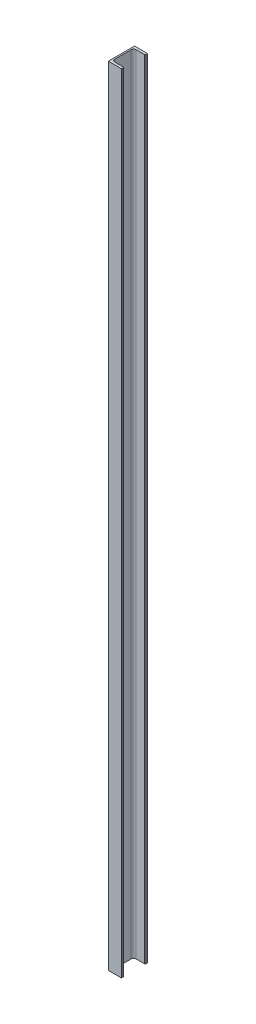
ISO-10303-21;
HEADER;
FILE_DESCRIPTION(('STEP AP214'),'2;1');
FILE_NAME('part.step','',(''),(''),'','','');
FILE_SCHEMA(('AUTOMOTIVE_DESIGN { 1 0 10303 214 1 1 1 1 }'));
ENDSEC;
DATA;
#1=APPLICATION_CONTEXT('core data for automotive mechanical design processes');
#2=APPLICATION_PROTOCOL_DEFINITION('international standard','automotive_design',2000,#1);
#3=PRODUCT_CONTEXT('',#1,'mechanical');
#4=PRODUCT('Part','Part','',(#3));
#5=PRODUCT_RELATED_PRODUCT_CATEGORY('part','',(#4));
#6=PRODUCT_DEFINITION_FORMATION('','',#4);
#7=PRODUCT_DEFINITION_CONTEXT('part definition',#1,'design');
#8=PRODUCT_DEFINITION('design','',#6,#7);
#9=PRODUCT_DEFINITION_SHAPE('','',#8);
#10=(LENGTH_UNIT() NAMED_UNIT(*) SI_UNIT(.MILLI.,.METRE.));
#11=(NAMED_UNIT(*) PLANE_ANGLE_UNIT() SI_UNIT($,.RADIAN.));
#12=(NAMED_UNIT(*) SI_UNIT($,.STERADIAN.) SOLID_ANGLE_UNIT());
#13=UNCERTAINTY_MEASURE_WITH_UNIT(LENGTH_MEASURE(1.E-05),#10,'distance_accuracy_value','');
#14=(GEOMETRIC_REPRESENTATION_CONTEXT(3) GLOBAL_UNCERTAINTY_ASSIGNED_CONTEXT((#13)) GLOBAL_UNIT_ASSIGNED_CONTEXT((#10,
#11,#12)) REPRESENTATION_CONTEXT('',''));
#15=CARTESIAN_POINT('',(0.,0.,0.));
#16=DIRECTION('',(0.,0.,1.));
#17=DIRECTION('',(1.,0.,0.));
#18=AXIS2_PLACEMENT_3D('',#15,#16,#17);
#19=CARTESIAN_POINT('',(-20.,2400.,-40.));
#20=DIRECTION('',(0.,0.,1.));
#21=DIRECTION('',(1.,0.,0.));
#22=AXIS2_PLACEMENT_3D('',#19,#20,#21);
#23=PLANE('',#22);
#24=DIRECTION('',(-1.,0.,0.));
#25=VECTOR('',#24,1.);
#26=CARTESIAN_POINT('',(-20.,0.,-40.));
#27=LINE('',#26,#25);
#28=CARTESIAN_POINT('',(20.,0.,-40.));
#29=VERTEX_POINT('',#28);
#30=CARTESIAN_POINT('',(-20.,0.,-40.));
#31=VERTEX_POINT('',#30);
#32=EDGE_CURVE('E153',#29,#31,#27,.T.);
#33=ORIENTED_EDGE('',*,*,#32,.T.);
#34=DIRECTION('',(0.,-1.,0.));
#35=VECTOR('',#34,1.);
#36=CARTESIAN_POINT('',(-20.,2400.,-40.));
#37=LINE('',#36,#35);
#38=CARTESIAN_POINT('',(-20.,2400.,-40.));
#39=VERTEX_POINT('',#38);
#40=EDGE_CURVE('E11',#39,#31,#37,.T.);
#41=ORIENTED_EDGE('',*,*,#40,.F.);
#42=DIRECTION('',(-1.,0.,0.));
#43=VECTOR('',#42,1.);
#44=CARTESIAN_POINT('',(-20.,2400.,-40.));
#45=LINE('',#44,#43);
#46=CARTESIAN_POINT('',(20.,2400.,-40.));
#47=VERTEX_POINT('',#46);
#48=EDGE_CURVE('E175',#47,#39,#45,.T.);
#49=ORIENTED_EDGE('',*,*,#48,.F.);
#50=DIRECTION('',(0.,-1.,0.));
#51=VECTOR('',#50,1.);
#52=CARTESIAN_POINT('',(20.,2400.,-40.));
#53=LINE('',#52,#51);
#54=EDGE_CURVE('E149',#47,#29,#53,.T.);
#55=ORIENTED_EDGE('',*,*,#54,.T.);
#56=EDGE_LOOP('',(#33,#41,#49,#55));
#57=FACE_BOUND('',#56,.T.);
#58=ADVANCED_FACE('F33',(#57),#23,.F.);
#59=CARTESIAN_POINT('',(-20.,2400.,40.));
#60=DIRECTION('',(1.,0.,0.));
#61=DIRECTION('',(0.,0.,-1.));
#62=AXIS2_PLACEMENT_3D('',#59,#60,#61);
#63=PLANE('',#62);
#64=DIRECTION('',(0.,0.,1.));
#65=VECTOR('',#64,1.);
#66=CARTESIAN_POINT('',(-20.,0.,40.));
#67=LINE('',#66,#65);
#68=CARTESIAN_POINT('',(-20.,0.,40.));
#69=VERTEX_POINT('',#68);
#70=EDGE_CURVE('E156',#31,#69,#67,.T.);
#71=ORIENTED_EDGE('',*,*,#70,.T.);
#72=DIRECTION('',(0.,-1.,0.));
#73=VECTOR('',#72,1.);
#74=CARTESIAN_POINT('',(-20.,2400.,40.));
#75=LINE('',#74,#73);
#76=CARTESIAN_POINT('',(-20.,2400.,40.));
#77=VERTEX_POINT('',#76);
#78=EDGE_CURVE('E41',#77,#69,#75,.T.);
#79=ORIENTED_EDGE('',*,*,#78,.F.);
#80=DIRECTION('',(0.,0.,1.));
#81=VECTOR('',#80,1.);
#82=CARTESIAN_POINT('',(-20.,2400.,40.));
#83=LINE('',#82,#81);
#84=EDGE_CURVE('E104',#39,#77,#83,.T.);
#85=ORIENTED_EDGE('',*,*,#84,.F.);
#86=ORIENTED_EDGE('',*,*,#40,.T.);
#87=EDGE_LOOP('',(#71,#79,#85,#86));
#88=FACE_BOUND('',#87,.T.);
#89=ADVANCED_FACE('F253',(#88),#63,.F.);
#90=CARTESIAN_POINT('',(-20.,2400.,40.));
#91=DIRECTION('',(0.,0.,-1.));
#92=DIRECTION('',(-1.,0.,0.));
#93=AXIS2_PLACEMENT_3D('',#90,#91,#92);
#94=PLANE('',#93);
#95=DIRECTION('',(1.,0.,0.));
#96=VECTOR('',#95,1.);
#97=CARTESIAN_POINT('',(-20.,0.,40.));
#98=LINE('',#97,#96);
#99=CARTESIAN_POINT('',(20.,0.,40.));
#100=VERTEX_POINT('',#99);
#101=EDGE_CURVE('E158',#69,#100,#98,.T.);
#102=ORIENTED_EDGE('',*,*,#101,.T.);
#103=DIRECTION('',(0.,-1.,0.));
#104=VECTOR('',#103,1.);
#105=CARTESIAN_POINT('',(20.,2400.,40.));
#106=LINE('',#105,#104);
#107=CARTESIAN_POINT('',(20.,2400.,40.));
#108=VERTEX_POINT('',#107);
#109=EDGE_CURVE('E194',#108,#100,#106,.T.);
#110=ORIENTED_EDGE('',*,*,#109,.F.);
#111=DIRECTION('',(1.,0.,0.));
#112=VECTOR('',#111,1.);
#113=CARTESIAN_POINT('',(-20.,2400.,40.));
#114=LINE('',#113,#112);
#115=EDGE_CURVE('E202',#77,#108,#114,.T.);
#116=ORIENTED_EDGE('',*,*,#115,.F.);
#117=ORIENTED_EDGE('',*,*,#78,.T.);
#118=EDGE_LOOP('',(#102,#110,#116,#117));
#119=FACE_BOUND('',#118,.T.);
#120=ADVANCED_FACE('F200',(#119),#94,.F.);
#121=CARTESIAN_POINT('',(20.,2400.,40.));
#122=DIRECTION('',(-1.,0.,0.));
#123=DIRECTION('',(0.,0.,1.));
#124=AXIS2_PLACEMENT_3D('',#121,#122,#123);
#125=PLANE('',#124);
#126=DIRECTION('',(0.,0.,-1.));
#127=VECTOR('',#126,1.);
#128=CARTESIAN_POINT('',(20.,0.,40.));
#129=LINE('',#128,#127);
#130=CARTESIAN_POINT('',(20.,0.,35.1));
#131=VERTEX_POINT('',#130);
#132=EDGE_CURVE('E160',#100,#131,#129,.T.);
#133=ORIENTED_EDGE('',*,*,#132,.T.);
#134=DIRECTION('',(0.,-1.,0.));
#135=VECTOR('',#134,1.);
#136=CARTESIAN_POINT('',(20.,2400.,35.1));
#137=LINE('',#136,#135);
#138=CARTESIAN_POINT('',(20.,2400.,35.1));
#139=VERTEX_POINT('',#138);
#140=EDGE_CURVE('E191',#139,#131,#137,.T.);
#141=ORIENTED_EDGE('',*,*,#140,.F.);
#142=DIRECTION('',(0.,0.,-1.));
#143=VECTOR('',#142,1.);
#144=CARTESIAN_POINT('',(20.,2400.,40.));
#145=LINE('',#144,#143);
#146=EDGE_CURVE('E220',#108,#139,#145,.T.);
#147=ORIENTED_EDGE('',*,*,#146,.F.);
#148=ORIENTED_EDGE('',*,*,#109,.T.);
#149=EDGE_LOOP('',(#133,#141,#147,#148));
#150=FACE_BOUND('',#149,.T.);
#151=ADVANCED_FACE('F211',(#150),#125,.F.);
#152=CARTESIAN_POINT('',(17.5,2400.,35.1));
#153=DIRECTION('',(0.,-1.,0.));
#154=DIRECTION('',(0.,0.,-1.));
#155=AXIS2_PLACEMENT_3D('',#152,#153,#154);
#156=CYLINDRICAL_SURFACE('',#155,2.5);
#157=CARTESIAN_POINT('',(17.5,0.,35.1));
#158=DIRECTION('',(0.,1.,0.));
#159=DIRECTION('',(0.,0.,1.));
#160=AXIS2_PLACEMENT_3D('',#157,#158,#159);
#161=CIRCLE('',#160,2.5);
#162=CARTESIAN_POINT('',(17.5,0.,32.6));
#163=VERTEX_POINT('',#162);
#164=EDGE_CURVE('E162',#131,#163,#161,.T.);
#165=ORIENTED_EDGE('',*,*,#164,.T.);
#166=DIRECTION('',(0.,-1.,0.));
#167=VECTOR('',#166,1.);
#168=CARTESIAN_POINT('',(17.5,2400.,32.6));
#169=LINE('',#168,#167);
#170=CARTESIAN_POINT('',(17.5,2400.,32.6));
#171=VERTEX_POINT('',#170);
#172=EDGE_CURVE('E188',#171,#163,#169,.T.);
#173=ORIENTED_EDGE('',*,*,#172,.F.);
#174=CARTESIAN_POINT('',(17.5,2400.,35.1));
#175=DIRECTION('',(0.,1.,0.));
#176=DIRECTION('',(0.,0.,1.));
#177=AXIS2_PLACEMENT_3D('',#174,#175,#176);
#178=CIRCLE('',#177,2.5);
#179=EDGE_CURVE('E217',#139,#171,#178,.T.);
#180=ORIENTED_EDGE('',*,*,#179,.F.);
#181=ORIENTED_EDGE('',*,*,#140,.T.);
#182=EDGE_LOOP('',(#165,#173,#180,#181));
#183=FACE_BOUND('',#182,.T.);
#184=ADVANCED_FACE('F215',(#183),#156,.T.);
#185=CARTESIAN_POINT('',(17.5,2400.,32.6));
#186=DIRECTION('',(0.,0.,1.));
#187=DIRECTION('',(1.,0.,0.));
#188=AXIS2_PLACEMENT_3D('',#185,#186,#187);
#189=PLANE('',#188);
#190=DIRECTION('',(-1.,0.,0.));
#191=VECTOR('',#190,1.);
#192=CARTESIAN_POINT('',(17.5,0.,32.6));
#193=LINE('',#192,#191);
#194=CARTESIAN_POINT('',(-7.99999999999999,0.,32.6));
#195=VERTEX_POINT('',#194);
#196=EDGE_CURVE('E164',#163,#195,#193,.T.);
#197=ORIENTED_EDGE('',*,*,#196,.T.);
#198=DIRECTION('',(0.,-1.,0.));
#199=VECTOR('',#198,1.);
#200=CARTESIAN_POINT('',(-7.99999999999999,2400.,32.6));
#201=LINE('',#200,#199);
#202=CARTESIAN_POINT('',(-7.99999999999999,2400.,32.6));
#203=VERTEX_POINT('',#202);
#204=EDGE_CURVE('E185',#203,#195,#201,.T.);
#205=ORIENTED_EDGE('',*,*,#204,.F.);
#206=DIRECTION('',(-1.,0.,0.));
#207=VECTOR('',#206,1.);
#208=CARTESIAN_POINT('',(17.5,2400.,32.6));
#209=LINE('',#208,#207);
#210=EDGE_CURVE('E219',#171,#203,#209,.T.);
#211=ORIENTED_EDGE('',*,*,#210,.F.);
#212=ORIENTED_EDGE('',*,*,#172,.T.);
#213=EDGE_LOOP('',(#197,#205,#211,#212));
#214=FACE_BOUND('',#213,.T.);
#215=ADVANCED_FACE('F266',(#214),#189,.F.);
#216=CARTESIAN_POINT('',(-7.99999999999999,2400.,25.1));
#217=DIRECTION('',(0.,-1.,0.));
#218=DIRECTION('',(0.,0.,-1.));
#219=AXIS2_PLACEMENT_3D('',#216,#217,#218);
#220=CYLINDRICAL_SURFACE('',#219,7.5);
#221=CARTESIAN_POINT('',(-7.99999999999999,0.,25.1));
#222=DIRECTION('',(0.,-1.,0.));
#223=DIRECTION('',(0.,0.,1.));
#224=AXIS2_PLACEMENT_3D('',#221,#222,#223);
#225=CIRCLE('',#224,7.5);
#226=CARTESIAN_POINT('',(-15.5,0.,25.1));
#227=VERTEX_POINT('',#226);
#228=EDGE_CURVE('E166',#195,#227,#225,.T.);
#229=ORIENTED_EDGE('',*,*,#228,.T.);
#230=DIRECTION('',(0.,-1.,0.));
#231=VECTOR('',#230,1.);
#232=CARTESIAN_POINT('',(-15.5,2400.,25.1));
#233=LINE('',#232,#231);
#234=CARTESIAN_POINT('',(-15.5,2400.,25.1));
#235=VERTEX_POINT('',#234);
#236=EDGE_CURVE('E182',#235,#227,#233,.T.);
#237=ORIENTED_EDGE('',*,*,#236,.F.);
#238=CARTESIAN_POINT('',(-7.99999999999999,2400.,25.1));
#239=DIRECTION('',(0.,-1.,0.));
#240=DIRECTION('',(0.,0.,1.));
#241=AXIS2_PLACEMENT_3D('',#238,#239,#240);
#242=CIRCLE('',#241,7.5);
#243=EDGE_CURVE('E222',#203,#235,#242,.T.);
#244=ORIENTED_EDGE('',*,*,#243,.F.);
#245=ORIENTED_EDGE('',*,*,#204,.T.);
#246=EDGE_LOOP('',(#229,#237,#244,#245));
#247=FACE_BOUND('',#246,.T.);
#248=ADVANCED_FACE('F269',(#247),#220,.F.);
#249=CARTESIAN_POINT('',(-15.5,2400.,-25.0999999999999));
#250=DIRECTION('',(-1.,0.,0.));
#251=DIRECTION('',(0.,0.,1.));
#252=AXIS2_PLACEMENT_3D('',#249,#250,#251);
#253=PLANE('',#252);
#254=DIRECTION('',(0.,0.,-1.));
#255=VECTOR('',#254,1.);
#256=CARTESIAN_POINT('',(-15.5,0.,-25.0999999999999));
#257=LINE('',#256,#255);
#258=CARTESIAN_POINT('',(-15.5,0.,-25.0999999999999));
#259=VERTEX_POINT('',#258);
#260=EDGE_CURVE('E168',#227,#259,#257,.T.);
#261=ORIENTED_EDGE('',*,*,#260,.T.);
#262=DIRECTION('',(0.,-1.,0.));
#263=VECTOR('',#262,1.);
#264=CARTESIAN_POINT('',(-15.5,2400.,-25.0999999999999));
#265=LINE('',#264,#263);
#266=CARTESIAN_POINT('',(-15.5,2400.,-25.0999999999999));
#267=VERTEX_POINT('',#266);
#268=EDGE_CURVE('E179',#267,#259,#265,.T.);
#269=ORIENTED_EDGE('',*,*,#268,.F.);
#270=DIRECTION('',(0.,0.,-1.));
#271=VECTOR('',#270,1.);
#272=CARTESIAN_POINT('',(-15.5,2400.,-25.0999999999999));
#273=LINE('',#272,#271);
#274=EDGE_CURVE('E228',#235,#267,#273,.T.);
#275=ORIENTED_EDGE('',*,*,#274,.F.);
#276=ORIENTED_EDGE('',*,*,#236,.T.);
#277=EDGE_LOOP('',(#261,#269,#275,#276));
#278=FACE_BOUND('',#277,.T.);
#279=ADVANCED_FACE('F234',(#278),#253,.F.);
#280=CARTESIAN_POINT('',(-8.,2400.,-25.1));
#281=DIRECTION('',(0.,-1.,0.));
#282=DIRECTION('',(0.,0.,-1.));
#283=AXIS2_PLACEMENT_3D('',#280,#281,#282);
#284=CYLINDRICAL_SURFACE('',#283,7.5);
#285=CARTESIAN_POINT('',(-8.,0.,-25.1));
#286=DIRECTION('',(0.,-1.,0.));
#287=DIRECTION('',(0.,0.,-1.));
#288=AXIS2_PLACEMENT_3D('',#285,#286,#287);
#289=CIRCLE('',#288,7.5);
#290=CARTESIAN_POINT('',(-7.99999999999994,0.,-32.6));
#291=VERTEX_POINT('',#290);
#292=EDGE_CURVE('E170',#259,#291,#289,.T.);
#293=ORIENTED_EDGE('',*,*,#292,.T.);
#294=DIRECTION('',(0.,-1.,0.));
#295=VECTOR('',#294,1.);
#296=CARTESIAN_POINT('',(-7.99999999999994,2400.,-32.6));
#297=LINE('',#296,#295);
#298=CARTESIAN_POINT('',(-7.99999999999994,2400.,-32.6));
#299=VERTEX_POINT('',#298);
#300=EDGE_CURVE('E144',#299,#291,#297,.T.);
#301=ORIENTED_EDGE('',*,*,#300,.F.);
#302=CARTESIAN_POINT('',(-8.,2400.,-25.1));
#303=DIRECTION('',(0.,-1.,0.));
#304=DIRECTION('',(0.,0.,-1.));
#305=AXIS2_PLACEMENT_3D('',#302,#303,#304);
#306=CIRCLE('',#305,7.5);
#307=EDGE_CURVE('E135',#267,#299,#306,.T.);
#308=ORIENTED_EDGE('',*,*,#307,.F.);
#309=ORIENTED_EDGE('',*,*,#268,.T.);
#310=EDGE_LOOP('',(#293,#301,#308,#309));
#311=FACE_BOUND('',#310,.T.);
#312=ADVANCED_FACE('F238',(#311),#284,.F.);
#313=CARTESIAN_POINT('',(17.5,2400.,-32.6));
#314=DIRECTION('',(0.,0.,-1.));
#315=DIRECTION('',(-1.,0.,0.));
#316=AXIS2_PLACEMENT_3D('',#313,#314,#315);
#317=PLANE('',#316);
#318=DIRECTION('',(1.,0.,0.));
#319=VECTOR('',#318,1.);
#320=CARTESIAN_POINT('',(17.5,0.,-32.6));
#321=LINE('',#320,#319);
#322=CARTESIAN_POINT('',(17.5,0.,-32.6));
#323=VERTEX_POINT('',#322);
#324=EDGE_CURVE('E143',#291,#323,#321,.T.);
#325=ORIENTED_EDGE('',*,*,#324,.T.);
#326=DIRECTION('',(0.,-1.,0.));
#327=VECTOR('',#326,1.);
#328=CARTESIAN_POINT('',(17.5,2400.,-32.6));
#329=LINE('',#328,#327);
#330=CARTESIAN_POINT('',(17.5,2400.,-32.6));
#331=VERTEX_POINT('',#330);
#332=EDGE_CURVE('E140',#331,#323,#329,.T.);
#333=ORIENTED_EDGE('',*,*,#332,.F.);
#334=DIRECTION('',(1.,0.,0.));
#335=VECTOR('',#334,1.);
#336=CARTESIAN_POINT('',(17.5,2400.,-32.6));
#337=LINE('',#336,#335);
#338=EDGE_CURVE('E129',#299,#331,#337,.T.);
#339=ORIENTED_EDGE('',*,*,#338,.F.);
#340=ORIENTED_EDGE('',*,*,#300,.T.);
#341=EDGE_LOOP('',(#325,#333,#339,#340));
#342=FACE_BOUND('',#341,.T.);
#343=ADVANCED_FACE('F141',(#342),#317,.F.);
#344=CARTESIAN_POINT('',(17.5,2400.,-35.1));
#345=DIRECTION('',(0.,-1.,0.));
#346=DIRECTION('',(0.,0.,-1.));
#347=AXIS2_PLACEMENT_3D('',#344,#345,#346);
#348=CYLINDRICAL_SURFACE('',#347,2.5);
#349=CARTESIAN_POINT('',(17.5,0.,-35.1));
#350=DIRECTION('',(0.,1.,0.));
#351=DIRECTION('',(0.,0.,-1.));
#352=AXIS2_PLACEMENT_3D('',#349,#350,#351);
#353=CIRCLE('',#352,2.5);
#354=CARTESIAN_POINT('',(20.,0.,-35.1));
#355=VERTEX_POINT('',#354);
#356=EDGE_CURVE('E90',#323,#355,#353,.T.);
#357=ORIENTED_EDGE('',*,*,#356,.T.);
#358=DIRECTION('',(0.,-1.,0.));
#359=VECTOR('',#358,1.);
#360=CARTESIAN_POINT('',(20.,2400.,-35.1));
#361=LINE('',#360,#359);
#362=CARTESIAN_POINT('',(20.,2400.,-35.1));
#363=VERTEX_POINT('',#362);
#364=EDGE_CURVE('E145',#363,#355,#361,.T.);
#365=ORIENTED_EDGE('',*,*,#364,.F.);
#366=CARTESIAN_POINT('',(17.5,2400.,-35.1));
#367=DIRECTION('',(0.,1.,0.));
#368=DIRECTION('',(0.,0.,-1.));
#369=AXIS2_PLACEMENT_3D('',#366,#367,#368);
#370=CIRCLE('',#369,2.5);
#371=EDGE_CURVE('E133',#331,#363,#370,.T.);
#372=ORIENTED_EDGE('',*,*,#371,.F.);
#373=ORIENTED_EDGE('',*,*,#332,.T.);
#374=EDGE_LOOP('',(#357,#365,#372,#373));
#375=FACE_BOUND('',#374,.T.);
#376=ADVANCED_FACE('F147',(#375),#348,.T.);
#377=CARTESIAN_POINT('',(20.,2400.,-35.1));
#378=DIRECTION('',(-1.,0.,0.));
#379=DIRECTION('',(0.,0.,1.));
#380=AXIS2_PLACEMENT_3D('',#377,#378,#379);
#381=PLANE('',#380);
#382=DIRECTION('',(0.,0.,-1.));
#383=VECTOR('',#382,1.);
#384=CARTESIAN_POINT('',(20.,0.,-35.1));
#385=LINE('',#384,#383);
#386=EDGE_CURVE('E96',#355,#29,#385,.T.);
#387=ORIENTED_EDGE('',*,*,#386,.T.);
#388=ORIENTED_EDGE('',*,*,#54,.F.);
#389=DIRECTION('',(0.,0.,-1.));
#390=VECTOR('',#389,1.);
#391=CARTESIAN_POINT('',(20.,2400.,-35.1));
#392=LINE('',#391,#390);
#393=EDGE_CURVE('E49',#363,#47,#392,.T.);
#394=ORIENTED_EDGE('',*,*,#393,.F.);
#395=ORIENTED_EDGE('',*,*,#364,.T.);
#396=EDGE_LOOP('',(#387,#388,#394,#395));
#397=FACE_BOUND('',#396,.T.);
#398=ADVANCED_FACE('F242',(#397),#381,.F.);
#399=CARTESIAN_POINT('',(17.5,2400.,-35.1));
#400=DIRECTION('',(0.,-1.,0.));
#401=DIRECTION('',(0.,0.,-1.));
#402=AXIS2_PLACEMENT_3D('',#399,#400,#401);
#403=PLANE('',#402);
#404=ORIENTED_EDGE('',*,*,#48,.T.);
#405=ORIENTED_EDGE('',*,*,#84,.T.);
#406=ORIENTED_EDGE('',*,*,#115,.T.);
#407=ORIENTED_EDGE('',*,*,#146,.T.);
#408=ORIENTED_EDGE('',*,*,#179,.T.);
#409=ORIENTED_EDGE('',*,*,#210,.T.);
#410=ORIENTED_EDGE('',*,*,#243,.T.);
#411=ORIENTED_EDGE('',*,*,#274,.T.);
#412=ORIENTED_EDGE('',*,*,#307,.T.);
#413=ORIENTED_EDGE('',*,*,#338,.T.);
#414=ORIENTED_EDGE('',*,*,#371,.T.);
#415=ORIENTED_EDGE('',*,*,#393,.T.);
#416=EDGE_LOOP('',(#404,#405,#406,#407,#408,#409,#410,#411,#412,#413,#414,#415));
#417=FACE_BOUND('',#416,.T.);
#418=ADVANCED_FACE('F131',(#417),#403,.F.);
#419=CARTESIAN_POINT('',(17.5,0.,-35.1));
#420=DIRECTION('',(0.,-1.,0.));
#421=DIRECTION('',(0.,0.,-1.));
#422=AXIS2_PLACEMENT_3D('',#419,#420,#421);
#423=PLANE('',#422);
#424=ORIENTED_EDGE('',*,*,#32,.F.);
#425=ORIENTED_EDGE('',*,*,#386,.F.);
#426=ORIENTED_EDGE('',*,*,#356,.F.);
#427=ORIENTED_EDGE('',*,*,#324,.F.);
#428=ORIENTED_EDGE('',*,*,#292,.F.);
#429=ORIENTED_EDGE('',*,*,#260,.F.);
#430=ORIENTED_EDGE('',*,*,#228,.F.);
#431=ORIENTED_EDGE('',*,*,#196,.F.);
#432=ORIENTED_EDGE('',*,*,#164,.F.);
#433=ORIENTED_EDGE('',*,*,#132,.F.);
#434=ORIENTED_EDGE('',*,*,#101,.F.);
#435=ORIENTED_EDGE('',*,*,#70,.F.);
#436=EDGE_LOOP('',(#424,#425,#426,#427,#428,#429,#430,#431,#432,#433,#434,#435));
#437=FACE_BOUND('',#436,.T.);
#438=ADVANCED_FACE('F206',(#437),#423,.T.);
#439=CLOSED_SHELL('',(#58,#89,#120,#151,#184,#215,#248,#279,#312,#343,#376,#398,#418,#438));
#440=MANIFOLD_SOLID_BREP('B2',#439);
#441=ADVANCED_BREP_SHAPE_REPRESENTATION('',(#18,#440),#14);
#442=SHAPE_DEFINITION_REPRESENTATION(#9,#441);
ENDSEC;
END-ISO-10303-21;
